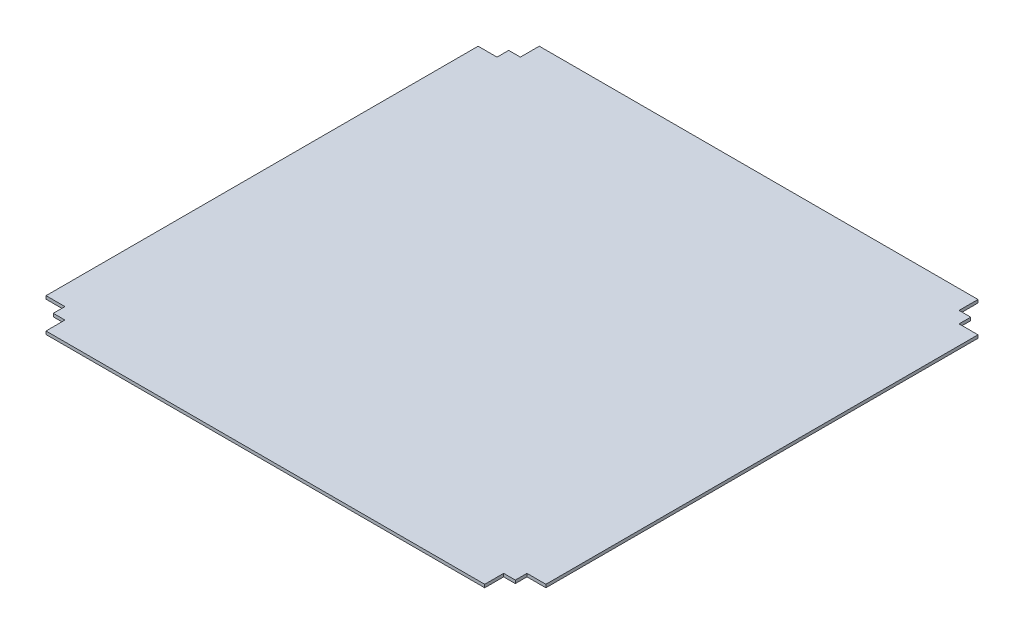
ISO-10303-21;
HEADER;
FILE_DESCRIPTION(('STEP AP214'),'2;1');
FILE_NAME('part.step','',(''),(''),'','','');
FILE_SCHEMA(('AUTOMOTIVE_DESIGN { 1 0 10303 214 1 1 1 1 }'));
ENDSEC;
DATA;
#1=APPLICATION_CONTEXT('core data for automotive mechanical design processes');
#2=APPLICATION_PROTOCOL_DEFINITION('international standard','automotive_design',2000,#1);
#3=PRODUCT_CONTEXT('',#1,'mechanical');
#4=PRODUCT('Part','Part','',(#3));
#5=PRODUCT_RELATED_PRODUCT_CATEGORY('part','',(#4));
#6=PRODUCT_DEFINITION_FORMATION('','',#4);
#7=PRODUCT_DEFINITION_CONTEXT('part definition',#1,'design');
#8=PRODUCT_DEFINITION('design','',#6,#7);
#9=PRODUCT_DEFINITION_SHAPE('','',#8);
#10=(LENGTH_UNIT() NAMED_UNIT(*) SI_UNIT(.MILLI.,.METRE.));
#11=(NAMED_UNIT(*) PLANE_ANGLE_UNIT() SI_UNIT($,.RADIAN.));
#12=(NAMED_UNIT(*) SI_UNIT($,.STERADIAN.) SOLID_ANGLE_UNIT());
#13=UNCERTAINTY_MEASURE_WITH_UNIT(LENGTH_MEASURE(1.E-05),#10,'distance_accuracy_value','');
#14=(GEOMETRIC_REPRESENTATION_CONTEXT(3) GLOBAL_UNCERTAINTY_ASSIGNED_CONTEXT((#13)) GLOBAL_UNIT_ASSIGNED_CONTEXT((#10,
#11,#12)) REPRESENTATION_CONTEXT('',''));
#15=CARTESIAN_POINT('',(0.,0.,0.));
#16=DIRECTION('',(0.,0.,1.));
#17=DIRECTION('',(1.,0.,0.));
#18=AXIS2_PLACEMENT_3D('',#15,#16,#17);
#19=CARTESIAN_POINT('',(257.25,3.175,-253.875));
#20=DIRECTION('',(-1.,0.,0.));
#21=DIRECTION('',(0.,0.,1.));
#22=AXIS2_PLACEMENT_3D('',#19,#20,#21);
#23=PLANE('',#22);
#24=DIRECTION('',(0.,0.,-1.));
#25=VECTOR('',#24,1.);
#26=CARTESIAN_POINT('',(257.25,0.,-253.875));
#27=LINE('',#26,#25);
#28=CARTESIAN_POINT('',(257.25,-6.07191814189223E-10,222.375000000014));
#29=VERTEX_POINT('',#28);
#30=CARTESIAN_POINT('',(257.25,-6.07191814189223E-10,-222.37500000019));
#31=VERTEX_POINT('',#30);
#32=EDGE_CURVE('E269',#29,#31,#27,.T.);
#33=ORIENTED_EDGE('',*,*,#32,.T.);
#34=DIRECTION('',(0.,1.,0.));
#35=VECTOR('',#34,1.);
#36=CARTESIAN_POINT('',(257.25,-6.07191814189223E-10,-222.37500000019));
#37=LINE('',#36,#35);
#38=CARTESIAN_POINT('',(257.25,3.175,-222.37500000019));
#39=VERTEX_POINT('',#38);
#40=EDGE_CURVE('E294',#31,#39,#37,.T.);
#41=ORIENTED_EDGE('',*,*,#40,.T.);
#42=DIRECTION('',(0.,0.,-1.));
#43=VECTOR('',#42,1.);
#44=CARTESIAN_POINT('',(257.25,3.175,-253.875));
#45=LINE('',#44,#43);
#46=CARTESIAN_POINT('',(257.25,3.175,222.375000000014));
#47=VERTEX_POINT('',#46);
#48=EDGE_CURVE('E257',#47,#39,#45,.T.);
#49=ORIENTED_EDGE('',*,*,#48,.F.);
#50=DIRECTION('',(0.,1.,0.));
#51=VECTOR('',#50,1.);
#52=CARTESIAN_POINT('',(257.25,-6.07191814189223E-10,222.375000000014));
#53=LINE('',#52,#51);
#54=EDGE_CURVE('E249',#29,#47,#53,.T.);
#55=ORIENTED_EDGE('',*,*,#54,.F.);
#56=EDGE_LOOP('',(#33,#41,#49,#55));
#57=FACE_BOUND('',#56,.T.);
#58=ADVANCED_FACE('F91',(#57),#23,.F.);
#59=CARTESIAN_POINT('',(-257.25,3.175,-253.875));
#60=DIRECTION('',(1.,0.,0.));
#61=DIRECTION('',(0.,0.,-1.));
#62=AXIS2_PLACEMENT_3D('',#59,#60,#61);
#63=PLANE('',#62);
#64=DIRECTION('',(0.,0.,1.));
#65=VECTOR('',#64,1.);
#66=CARTESIAN_POINT('',(-257.25,0.,-253.875));
#67=LINE('',#66,#65);
#68=CARTESIAN_POINT('',(-257.25,-6.07191814189223E-10,-222.374999999792));
#69=VERTEX_POINT('',#68);
#70=CARTESIAN_POINT('',(-257.25,-6.07191814189223E-10,222.375000000257));
#71=VERTEX_POINT('',#70);
#72=EDGE_CURVE('E273',#69,#71,#67,.T.);
#73=ORIENTED_EDGE('',*,*,#72,.T.);
#74=DIRECTION('',(0.,1.,0.));
#75=VECTOR('',#74,1.);
#76=CARTESIAN_POINT('',(-257.25,-6.07191814189223E-10,222.375000000257));
#77=LINE('',#76,#75);
#78=CARTESIAN_POINT('',(-257.25,3.175,222.375000000257));
#79=VERTEX_POINT('',#78);
#80=EDGE_CURVE('E390',#71,#79,#77,.T.);
#81=ORIENTED_EDGE('',*,*,#80,.T.);
#82=DIRECTION('',(0.,0.,1.));
#83=VECTOR('',#82,1.);
#84=CARTESIAN_POINT('',(-257.25,3.175,-253.875));
#85=LINE('',#84,#83);
#86=CARTESIAN_POINT('',(-257.25,3.175,-222.374999999792));
#87=VERTEX_POINT('',#86);
#88=EDGE_CURVE('E256',#87,#79,#85,.T.);
#89=ORIENTED_EDGE('',*,*,#88,.F.);
#90=DIRECTION('',(0.,1.,0.));
#91=VECTOR('',#90,1.);
#92=CARTESIAN_POINT('',(-257.25,-6.07191814189223E-10,-222.374999999792));
#93=LINE('',#92,#91);
#94=EDGE_CURVE('E250',#69,#87,#93,.T.);
#95=ORIENTED_EDGE('',*,*,#94,.F.);
#96=EDGE_LOOP('',(#73,#81,#89,#95));
#97=FACE_BOUND('',#96,.T.);
#98=ADVANCED_FACE('F416',(#97),#63,.F.);
#99=CARTESIAN_POINT('',(0.,0.,0.));
#100=DIRECTION('',(0.,1.,0.));
#101=DIRECTION('',(0.,0.,1.));
#102=AXIS2_PLACEMENT_3D('',#99,#100,#101);
#103=PLANE('',#102);
#104=DIRECTION('',(1.,0.,0.));
#105=VECTOR('',#104,1.);
#106=CARTESIAN_POINT('',(0.,0.,222.375000000257));
#107=LINE('',#106,#105);
#108=CARTESIAN_POINT('',(-237.787500000013,-2.44856218634126E-12,222.375000000257));
#109=VERTEX_POINT('',#108);
#110=EDGE_CURVE('E281',#71,#109,#107,.T.);
#111=ORIENTED_EDGE('',*,*,#110,.F.);
#112=ORIENTED_EDGE('',*,*,#72,.F.);
#113=DIRECTION('',(-1.,0.,0.));
#114=VECTOR('',#113,1.);
#115=CARTESIAN_POINT('',(-2.35356624052224E-12,0.,-222.374999999794));
#116=LINE('',#115,#114);
#117=CARTESIAN_POINT('',(-237.787500000388,1.99272889855884E-10,-222.374999999792));
#118=VERTEX_POINT('',#117);
#119=EDGE_CURVE('E268',#118,#69,#116,.T.);
#120=ORIENTED_EDGE('',*,*,#119,.F.);
#121=DIRECTION('',(0.,0.,1.));
#122=VECTOR('',#121,1.);
#123=CARTESIAN_POINT('',(-237.787500000388,1.99186587362954E-10,-234.374999999792));
#124=LINE('',#123,#122);
#125=CARTESIAN_POINT('',(-237.787500000388,1.99186587362954E-10,-234.374999999792));
#126=VERTEX_POINT('',#125);
#127=EDGE_CURVE('E346',#126,#118,#124,.T.);
#128=ORIENTED_EDGE('',*,*,#127,.F.);
#129=DIRECTION('',(1.,0.,0.));
#130=VECTOR('',#129,1.);
#131=CARTESIAN_POINT('',(-253.253077604334,1.99130642530854E-10,-234.374999999792));
#132=LINE('',#131,#130);
#133=CARTESIAN_POINT('',(-225.787500000388,1.99229738609419E-10,-234.374999999792));
#134=VERTEX_POINT('',#133);
#135=EDGE_CURVE('E343',#126,#134,#132,.T.);
#136=ORIENTED_EDGE('',*,*,#135,.T.);
#137=DIRECTION('',(0.,0.,1.));
#138=VECTOR('',#137,1.);
#139=CARTESIAN_POINT('',(-225.787500000386,0.,2.38968336158883E-12));
#140=LINE('',#139,#138);
#141=CARTESIAN_POINT('',(-225.787500000388,-6.07191814189223E-10,-253.875));
#142=VERTEX_POINT('',#141);
#143=EDGE_CURVE('E279',#142,#134,#140,.T.);
#144=ORIENTED_EDGE('',*,*,#143,.F.);
#145=DIRECTION('',(-1.,0.,0.));
#146=VECTOR('',#145,1.);
#147=CARTESIAN_POINT('',(-257.25,0.,-253.875));
#148=LINE('',#147,#146);
#149=CARTESIAN_POINT('',(225.787499999742,-6.07191814189223E-10,-253.875));
#150=VERTEX_POINT('',#149);
#151=EDGE_CURVE('E248',#150,#142,#148,.T.);
#152=ORIENTED_EDGE('',*,*,#151,.F.);
#153=DIRECTION('',(0.,0.,-1.));
#154=VECTOR('',#153,1.);
#155=CARTESIAN_POINT('',(225.787499999743,0.,-1.60135051878888E-12));
#156=LINE('',#155,#154);
#157=CARTESIAN_POINT('',(225.787499999742,-6.07191814189223E-10,-234.37500000019));
#158=VERTEX_POINT('',#157);
#159=EDGE_CURVE('E12',#158,#150,#156,.T.);
#160=ORIENTED_EDGE('',*,*,#159,.F.);
#161=DIRECTION('',(-1.,0.,0.));
#162=VECTOR('',#161,1.);
#163=CARTESIAN_POINT('',(237.787499999742,-6.07148446102324E-10,-234.37500000019));
#164=LINE('',#163,#162);
#165=CARTESIAN_POINT('',(237.787499999742,-6.07148446102324E-10,-234.37500000019));
#166=VERTEX_POINT('',#165);
#167=EDGE_CURVE('E306',#166,#158,#164,.T.);
#168=ORIENTED_EDGE('',*,*,#167,.F.);
#169=DIRECTION('',(0.,0.,1.));
#170=VECTOR('',#169,1.);
#171=CARTESIAN_POINT('',(237.787499999742,-6.07259902085655E-10,-249.840577604136));
#172=LINE('',#171,#170);
#173=CARTESIAN_POINT('',(237.787499999742,-6.07062143609394E-10,-222.37500000019));
#174=VERTEX_POINT('',#173);
#175=EDGE_CURVE('E300',#166,#174,#172,.T.);
#176=ORIENTED_EDGE('',*,*,#175,.T.);
#177=DIRECTION('',(-1.,0.,0.));
#178=VECTOR('',#177,1.);
#179=CARTESIAN_POINT('',(-1.57714807780051E-12,0.,-222.375000000188));
#180=LINE('',#179,#178);
#181=EDGE_CURVE('E98',#31,#174,#180,.T.);
#182=ORIENTED_EDGE('',*,*,#181,.F.);
#183=ORIENTED_EDGE('',*,*,#32,.F.);
#184=DIRECTION('',(1.,0.,0.));
#185=VECTOR('',#184,1.);
#186=CARTESIAN_POINT('',(8.00729915073988E-13,0.,222.375000000015));
#187=LINE('',#186,#185);
#188=CARTESIAN_POINT('',(237.787499999974,2.48412401759879E-12,222.375000000014));
#189=VERTEX_POINT('',#188);
#190=EDGE_CURVE('E285',#189,#29,#187,.T.);
#191=ORIENTED_EDGE('',*,*,#190,.F.);
#192=DIRECTION('',(0.,0.,-1.));
#193=VECTOR('',#192,1.);
#194=CARTESIAN_POINT('',(237.787499999974,2.57042651052863E-12,234.375000000014));
#195=LINE('',#194,#193);
#196=CARTESIAN_POINT('',(237.787499999974,2.57042651052863E-12,234.375000000014));
#197=VERTEX_POINT('',#196);
#198=EDGE_CURVE('E302',#197,#189,#195,.T.);
#199=ORIENTED_EDGE('',*,*,#198,.F.);
#200=DIRECTION('',(-1.,0.,0.));
#201=VECTOR('',#200,1.);
#202=CARTESIAN_POINT('',(253.25307760392,2.62637134262889E-12,234.375000000014));
#203=LINE('',#202,#201);
#204=CARTESIAN_POINT('',(225.787499999974,2.52727526406371E-12,234.375000000014));
#205=VERTEX_POINT('',#204);
#206=EDGE_CURVE('E317',#197,#205,#203,.T.);
#207=ORIENTED_EDGE('',*,*,#206,.T.);
#208=DIRECTION('',(0.,0.,-1.));
#209=VECTOR('',#208,1.);
#210=CARTESIAN_POINT('',(225.787499999974,0.,-8.13017675996566E-13));
#211=LINE('',#210,#209);
#212=CARTESIAN_POINT('',(225.787499999974,-6.07191814189223E-10,253.875));
#213=VERTEX_POINT('',#212);
#214=EDGE_CURVE('E287',#213,#205,#211,.T.);
#215=ORIENTED_EDGE('',*,*,#214,.F.);
#216=DIRECTION('',(1.,0.,0.));
#217=VECTOR('',#216,1.);
#218=CARTESIAN_POINT('',(-257.25,0.,253.875));
#219=LINE('',#218,#217);
#220=CARTESIAN_POINT('',(-225.787500000013,-6.07191814189223E-10,253.875));
#221=VERTEX_POINT('',#220);
#222=EDGE_CURVE('E262',#221,#213,#219,.T.);
#223=ORIENTED_EDGE('',*,*,#222,.F.);
#224=DIRECTION('',(0.,0.,1.));
#225=VECTOR('',#224,1.);
#226=CARTESIAN_POINT('',(-225.787500000013,0.,0.));
#227=LINE('',#226,#225);
#228=CARTESIAN_POINT('',(-225.787500000013,-2.318891606512E-12,234.375000000257));
#229=VERTEX_POINT('',#228);
#230=EDGE_CURVE('E283',#229,#221,#227,.T.);
#231=ORIENTED_EDGE('',*,*,#230,.F.);
#232=DIRECTION('',(1.,0.,0.));
#233=VECTOR('',#232,1.);
#234=CARTESIAN_POINT('',(-237.787500000013,-2.36225969341142E-12,234.375000000257));
#235=LINE('',#234,#233);
#236=CARTESIAN_POINT('',(-237.787500000013,-2.36225969341142E-12,234.375000000257));
#237=VERTEX_POINT('',#236);
#238=EDGE_CURVE('E323',#237,#229,#235,.T.);
#239=ORIENTED_EDGE('',*,*,#238,.F.);
#240=DIRECTION('',(0.,0.,-1.));
#241=VECTOR('',#240,1.);
#242=CARTESIAN_POINT('',(-237.787500000013,-2.25080371007991E-12,249.840577604203));
#243=LINE('',#242,#241);
#244=EDGE_CURVE('E330',#237,#109,#243,.T.);
#245=ORIENTED_EDGE('',*,*,#244,.T.);
#246=EDGE_LOOP('',(#111,#112,#120,#128,#136,#144,#152,#160,#168,#176,#182,#183,#191,#199,#207,
#215,#223,#231,#239,#245));
#247=FACE_BOUND('',#246,.T.);
#248=ADVANCED_FACE('F304',(#247),#103,.F.);
#249=CARTESIAN_POINT('',(-257.25,3.175,-253.875));
#250=DIRECTION('',(0.,0.,1.));
#251=DIRECTION('',(1.,0.,0.));
#252=AXIS2_PLACEMENT_3D('',#249,#250,#251);
#253=PLANE('',#252);
#254=DIRECTION('',(0.,1.,0.));
#255=VECTOR('',#254,1.);
#256=CARTESIAN_POINT('',(225.787499999742,-6.07191814189223E-10,-253.875));
#257=LINE('',#256,#255);
#258=CARTESIAN_POINT('',(225.787499999742,3.175,-253.875));
#259=VERTEX_POINT('',#258);
#260=EDGE_CURVE('E381',#150,#259,#257,.T.);
#261=ORIENTED_EDGE('',*,*,#260,.F.);
#262=ORIENTED_EDGE('',*,*,#151,.T.);
#263=DIRECTION('',(0.,1.,0.));
#264=VECTOR('',#263,1.);
#265=CARTESIAN_POINT('',(-225.787500000388,-6.07191814189223E-10,-253.875));
#266=LINE('',#265,#264);
#267=CARTESIAN_POINT('',(-225.787500000388,3.175,-253.875));
#268=VERTEX_POINT('',#267);
#269=EDGE_CURVE('E232',#142,#268,#266,.T.);
#270=ORIENTED_EDGE('',*,*,#269,.T.);
#271=DIRECTION('',(-1.,0.,0.));
#272=VECTOR('',#271,1.);
#273=CARTESIAN_POINT('',(-257.25,3.175,-253.875));
#274=LINE('',#273,#272);
#275=EDGE_CURVE('E246',#259,#268,#274,.T.);
#276=ORIENTED_EDGE('',*,*,#275,.F.);
#277=EDGE_LOOP('',(#261,#262,#270,#276));
#278=FACE_BOUND('',#277,.T.);
#279=ADVANCED_FACE('F245',(#278),#253,.F.);
#280=CARTESIAN_POINT('',(-257.25,3.175,253.875));
#281=DIRECTION('',(0.,0.,-1.));
#282=DIRECTION('',(-1.,0.,0.));
#283=AXIS2_PLACEMENT_3D('',#280,#281,#282);
#284=PLANE('',#283);
#285=DIRECTION('',(0.,1.,0.));
#286=VECTOR('',#285,1.);
#287=CARTESIAN_POINT('',(-225.787500000013,-6.07191814189223E-10,253.875));
#288=LINE('',#287,#286);
#289=CARTESIAN_POINT('',(-225.787500000013,3.175,253.875));
#290=VERTEX_POINT('',#289);
#291=EDGE_CURVE('E385',#221,#290,#288,.T.);
#292=ORIENTED_EDGE('',*,*,#291,.F.);
#293=ORIENTED_EDGE('',*,*,#222,.T.);
#294=DIRECTION('',(0.,1.,0.));
#295=VECTOR('',#294,1.);
#296=CARTESIAN_POINT('',(225.787499999974,-6.07191814189223E-10,253.875));
#297=LINE('',#296,#295);
#298=CARTESIAN_POINT('',(225.787499999974,3.175,253.875));
#299=VERTEX_POINT('',#298);
#300=EDGE_CURVE('E336',#213,#299,#297,.T.);
#301=ORIENTED_EDGE('',*,*,#300,.T.);
#302=DIRECTION('',(1.,0.,0.));
#303=VECTOR('',#302,1.);
#304=CARTESIAN_POINT('',(-257.25,3.175,253.875));
#305=LINE('',#304,#303);
#306=EDGE_CURVE('E259',#290,#299,#305,.T.);
#307=ORIENTED_EDGE('',*,*,#306,.F.);
#308=EDGE_LOOP('',(#292,#293,#301,#307));
#309=FACE_BOUND('',#308,.T.);
#310=ADVANCED_FACE('F437',(#309),#284,.F.);
#311=CARTESIAN_POINT('',(0.,3.175,0.));
#312=DIRECTION('',(0.,1.,0.));
#313=DIRECTION('',(0.,0.,1.));
#314=AXIS2_PLACEMENT_3D('',#311,#312,#313);
#315=PLANE('',#314);
#316=ORIENTED_EDGE('',*,*,#88,.T.);
#317=DIRECTION('',(1.,0.,0.));
#318=VECTOR('',#317,1.);
#319=CARTESIAN_POINT('',(0.,3.175,222.375000000257));
#320=LINE('',#319,#318);
#321=CARTESIAN_POINT('',(-237.787500000013,3.175,222.375000000257));
#322=VERTEX_POINT('',#321);
#323=EDGE_CURVE('E360',#79,#322,#320,.T.);
#324=ORIENTED_EDGE('',*,*,#323,.T.);
#325=DIRECTION('',(0.,0.,1.));
#326=VECTOR('',#325,1.);
#327=CARTESIAN_POINT('',(-237.787500000013,3.175,0.));
#328=LINE('',#327,#326);
#329=CARTESIAN_POINT('',(-237.787500000013,3.175,234.375000000257));
#330=VERTEX_POINT('',#329);
#331=EDGE_CURVE('E357',#322,#330,#328,.T.);
#332=ORIENTED_EDGE('',*,*,#331,.T.);
#333=DIRECTION('',(-1.,0.,0.));
#334=VECTOR('',#333,1.);
#335=CARTESIAN_POINT('',(0.,3.175,234.375000000257));
#336=LINE('',#335,#334);
#337=CARTESIAN_POINT('',(-225.787500000013,3.175,234.375000000257));
#338=VERTEX_POINT('',#337);
#339=EDGE_CURVE('E355',#338,#330,#336,.T.);
#340=ORIENTED_EDGE('',*,*,#339,.F.);
#341=DIRECTION('',(0.,0.,1.));
#342=VECTOR('',#341,1.);
#343=CARTESIAN_POINT('',(-225.787500000013,3.175,0.));
#344=LINE('',#343,#342);
#345=EDGE_CURVE('E363',#338,#290,#344,.T.);
#346=ORIENTED_EDGE('',*,*,#345,.T.);
#347=ORIENTED_EDGE('',*,*,#306,.T.);
#348=DIRECTION('',(0.,0.,-1.));
#349=VECTOR('',#348,1.);
#350=CARTESIAN_POINT('',(225.787499999974,3.175,-8.13017675996566E-13));
#351=LINE('',#350,#349);
#352=CARTESIAN_POINT('',(225.787499999974,3.175,234.375000000014));
#353=VERTEX_POINT('',#352);
#354=EDGE_CURVE('E370',#299,#353,#351,.T.);
#355=ORIENTED_EDGE('',*,*,#354,.T.);
#356=DIRECTION('',(1.,0.,0.));
#357=VECTOR('',#356,1.);
#358=CARTESIAN_POINT('',(8.43939623813222E-13,3.175,234.375000000015));
#359=LINE('',#358,#357);
#360=CARTESIAN_POINT('',(237.787499999974,3.175,234.375000000014));
#361=VERTEX_POINT('',#360);
#362=EDGE_CURVE('E367',#353,#361,#359,.T.);
#363=ORIENTED_EDGE('',*,*,#362,.T.);
#364=DIRECTION('',(0.,0.,1.));
#365=VECTOR('',#364,1.);
#366=CARTESIAN_POINT('',(237.787499999974,3.175,-8.56227384735801E-13));
#367=LINE('',#366,#365);
#368=CARTESIAN_POINT('',(237.787499999974,3.175,222.375000000014));
#369=VERTEX_POINT('',#368);
#370=EDGE_CURVE('E365',#369,#361,#367,.T.);
#371=ORIENTED_EDGE('',*,*,#370,.F.);
#372=DIRECTION('',(1.,0.,0.));
#373=VECTOR('',#372,1.);
#374=CARTESIAN_POINT('',(8.00729915073988E-13,3.175,222.375000000015));
#375=LINE('',#374,#373);
#376=EDGE_CURVE('E373',#369,#47,#375,.T.);
#377=ORIENTED_EDGE('',*,*,#376,.T.);
#378=ORIENTED_EDGE('',*,*,#48,.T.);
#379=DIRECTION('',(-1.,0.,0.));
#380=VECTOR('',#379,1.);
#381=CARTESIAN_POINT('',(-1.57714807780051E-12,3.175,-222.375000000188));
#382=LINE('',#381,#380);
#383=CARTESIAN_POINT('',(237.787499999742,3.175,-222.37500000019));
#384=VERTEX_POINT('',#383);
#385=EDGE_CURVE('E377',#39,#384,#382,.T.);
#386=ORIENTED_EDGE('',*,*,#385,.T.);
#387=DIRECTION('',(0.,0.,-1.));
#388=VECTOR('',#387,1.);
#389=CARTESIAN_POINT('',(237.787499999743,3.175,-1.68645800359424E-12));
#390=LINE('',#389,#388);
#391=CARTESIAN_POINT('',(237.787499999742,3.175,-234.37500000019));
#392=VERTEX_POINT('',#391);
#393=EDGE_CURVE('E105',#384,#392,#390,.T.);
#394=ORIENTED_EDGE('',*,*,#393,.T.);
#395=DIRECTION('',(1.,0.,0.));
#396=VECTOR('',#395,1.);
#397=CARTESIAN_POINT('',(-1.66225556260586E-12,3.175,-234.375000000188));
#398=LINE('',#397,#396);
#399=CARTESIAN_POINT('',(225.787499999742,3.175,-234.37500000019));
#400=VERTEX_POINT('',#399);
#401=EDGE_CURVE('E113',#400,#392,#398,.T.);
#402=ORIENTED_EDGE('',*,*,#401,.F.);
#403=DIRECTION('',(0.,0.,-1.));
#404=VECTOR('',#403,1.);
#405=CARTESIAN_POINT('',(225.787499999743,3.175,-1.60135051878888E-12));
#406=LINE('',#405,#404);
#407=EDGE_CURVE('E254',#400,#259,#406,.T.);
#408=ORIENTED_EDGE('',*,*,#407,.T.);
#409=ORIENTED_EDGE('',*,*,#275,.T.);
#410=DIRECTION('',(0.,0.,1.));
#411=VECTOR('',#410,1.);
#412=CARTESIAN_POINT('',(-225.787500000386,3.175,2.38968336158883E-12));
#413=LINE('',#412,#411);
#414=CARTESIAN_POINT('',(-225.787500000388,3.175,-234.374999999792));
#415=VERTEX_POINT('',#414);
#416=EDGE_CURVE('E229',#268,#415,#413,.T.);
#417=ORIENTED_EDGE('',*,*,#416,.T.);
#418=DIRECTION('',(-1.,0.,0.));
#419=VECTOR('',#418,1.);
#420=CARTESIAN_POINT('',(-2.48057150139371E-12,3.175,-234.374999999794));
#421=LINE('',#420,#419);
#422=CARTESIAN_POINT('',(-237.787500000388,3.175,-234.374999999792));
#423=VERTEX_POINT('',#422);
#424=EDGE_CURVE('E240',#415,#423,#421,.T.);
#425=ORIENTED_EDGE('',*,*,#424,.T.);
#426=DIRECTION('',(0.,0.,-1.));
#427=VECTOR('',#426,1.);
#428=CARTESIAN_POINT('',(-237.787500000386,3.175,2.5166886224603E-12));
#429=LINE('',#428,#427);
#430=CARTESIAN_POINT('',(-237.787500000388,3.175,-222.374999999792));
#431=VERTEX_POINT('',#430);
#432=EDGE_CURVE('E351',#431,#423,#429,.T.);
#433=ORIENTED_EDGE('',*,*,#432,.F.);
#434=DIRECTION('',(-1.,0.,0.));
#435=VECTOR('',#434,1.);
#436=CARTESIAN_POINT('',(-2.35356624052224E-12,3.175,-222.374999999794));
#437=LINE('',#436,#435);
#438=EDGE_CURVE('E239',#431,#87,#437,.T.);
#439=ORIENTED_EDGE('',*,*,#438,.T.);
#440=EDGE_LOOP('',(#316,#324,#332,#340,#346,#347,#355,#363,#371,#377,#378,#386,#394,#402,#408,
#409,#417,#425,#433,#439));
#441=FACE_BOUND('',#440,.T.);
#442=ADVANCED_FACE('F253',(#441),#315,.T.);
#443=CARTESIAN_POINT('',(-240.787500000388,6.68750000019926,-222.374999999792));
#444=DIRECTION('',(0.,0.,-1.));
#445=DIRECTION('',(0.,1.,0.));
#446=AXIS2_PLACEMENT_3D('',#443,#444,#445);
#447=PLANE('',#446);
#448=DIRECTION('',(0.,1.,0.));
#449=VECTOR('',#448,1.);
#450=CARTESIAN_POINT('',(-237.787500000388,3.37500000019927,-222.374999999792));
#451=LINE('',#450,#449);
#452=EDGE_CURVE('E342',#118,#431,#451,.T.);
#453=ORIENTED_EDGE('',*,*,#452,.F.);
#454=ORIENTED_EDGE('',*,*,#119,.T.);
#455=ORIENTED_EDGE('',*,*,#94,.T.);
#456=ORIENTED_EDGE('',*,*,#438,.F.);
#457=EDGE_LOOP('',(#453,#454,#455,#456));
#458=FACE_BOUND('',#457,.T.);
#459=ADVANCED_FACE('F411',(#458),#447,.T.);
#460=CARTESIAN_POINT('',(-225.787500000388,6.68750000019921,-237.374999999792));
#461=DIRECTION('',(-1.,0.,0.));
#462=DIRECTION('',(0.,-1.,0.));
#463=AXIS2_PLACEMENT_3D('',#460,#461,#462);
#464=PLANE('',#463);
#465=ORIENTED_EDGE('',*,*,#416,.F.);
#466=ORIENTED_EDGE('',*,*,#269,.F.);
#467=ORIENTED_EDGE('',*,*,#143,.T.);
#468=DIRECTION('',(0.,1.,0.));
#469=VECTOR('',#468,1.);
#470=CARTESIAN_POINT('',(-225.787500000388,3.37500000019923,-234.374999999792));
#471=LINE('',#470,#469);
#472=EDGE_CURVE('E235',#134,#415,#471,.T.);
#473=ORIENTED_EDGE('',*,*,#472,.T.);
#474=EDGE_LOOP('',(#465,#466,#467,#473));
#475=FACE_BOUND('',#474,.T.);
#476=ADVANCED_FACE('F231',(#475),#464,.T.);
#477=CARTESIAN_POINT('',(-253.253077604334,3.37500000019913,-234.374999999792));
#478=DIRECTION('',(0.,0.,-1.));
#479=DIRECTION('',(0.,1.,0.));
#480=AXIS2_PLACEMENT_3D('',#477,#478,#479);
#481=PLANE('',#480);
#482=ORIENTED_EDGE('',*,*,#472,.F.);
#483=ORIENTED_EDGE('',*,*,#135,.F.);
#484=DIRECTION('',(0.,-1.,0.));
#485=VECTOR('',#484,1.);
#486=CARTESIAN_POINT('',(-237.787500000388,3.37500000019919,-234.374999999792));
#487=LINE('',#486,#485);
#488=EDGE_CURVE('E340',#423,#126,#487,.T.);
#489=ORIENTED_EDGE('',*,*,#488,.F.);
#490=ORIENTED_EDGE('',*,*,#424,.F.);
#491=EDGE_LOOP('',(#482,#483,#489,#490));
#492=FACE_BOUND('',#491,.T.);
#493=ADVANCED_FACE('F403',(#492),#481,.T.);
#494=CARTESIAN_POINT('',(-237.787500000388,6.68750000019917,-237.374999999792));
#495=DIRECTION('',(1.,0.,0.));
#496=DIRECTION('',(0.,1.,0.));
#497=AXIS2_PLACEMENT_3D('',#494,#495,#496);
#498=PLANE('',#497);
#499=ORIENTED_EDGE('',*,*,#432,.T.);
#500=ORIENTED_EDGE('',*,*,#488,.T.);
#501=ORIENTED_EDGE('',*,*,#127,.T.);
#502=ORIENTED_EDGE('',*,*,#452,.T.);
#503=EDGE_LOOP('',(#499,#500,#501,#502));
#504=FACE_BOUND('',#503,.T.);
#505=ADVANCED_FACE('F407',(#504),#498,.F.);
#506=CARTESIAN_POINT('',(-225.787500000013,6.6874999999977,237.375000000257));
#507=DIRECTION('',(-1.,0.,0.));
#508=DIRECTION('',(0.,1.,0.));
#509=AXIS2_PLACEMENT_3D('',#506,#507,#508);
#510=PLANE('',#509);
#511=DIRECTION('',(0.,1.,0.));
#512=VECTOR('',#511,1.);
#513=CARTESIAN_POINT('',(-225.787500000013,3.37499999999768,234.375000000257));
#514=LINE('',#513,#512);
#515=EDGE_CURVE('E329',#229,#338,#514,.T.);
#516=ORIENTED_EDGE('',*,*,#515,.F.);
#517=ORIENTED_EDGE('',*,*,#230,.T.);
#518=ORIENTED_EDGE('',*,*,#291,.T.);
#519=ORIENTED_EDGE('',*,*,#345,.F.);
#520=EDGE_LOOP('',(#516,#517,#518,#519));
#521=FACE_BOUND('',#520,.T.);
#522=ADVANCED_FACE('F433',(#521),#510,.T.);
#523=CARTESIAN_POINT('',(-240.787500000013,6.68749999999754,222.375000000257));
#524=DIRECTION('',(0.,0.,1.));
#525=DIRECTION('',(0.,-1.,0.));
#526=AXIS2_PLACEMENT_3D('',#523,#524,#525);
#527=PLANE('',#526);
#528=ORIENTED_EDGE('',*,*,#323,.F.);
#529=ORIENTED_EDGE('',*,*,#80,.F.);
#530=ORIENTED_EDGE('',*,*,#110,.T.);
#531=DIRECTION('',(0.,1.,0.));
#532=VECTOR('',#531,1.);
#533=CARTESIAN_POINT('',(-237.787500000013,3.37499999999755,222.375000000257));
#534=LINE('',#533,#532);
#535=EDGE_CURVE('E333',#109,#322,#534,.T.);
#536=ORIENTED_EDGE('',*,*,#535,.T.);
#537=EDGE_LOOP('',(#528,#529,#530,#536));
#538=FACE_BOUND('',#537,.T.);
#539=ADVANCED_FACE('F420',(#538),#527,.T.);
#540=CARTESIAN_POINT('',(-237.787500000013,3.37499999999775,249.840577604203));
#541=DIRECTION('',(-1.,0.,0.));
#542=DIRECTION('',(0.,1.,0.));
#543=AXIS2_PLACEMENT_3D('',#540,#541,#542);
#544=PLANE('',#543);
#545=ORIENTED_EDGE('',*,*,#535,.F.);
#546=ORIENTED_EDGE('',*,*,#244,.F.);
#547=DIRECTION('',(0.,-1.,0.));
#548=VECTOR('',#547,1.);
#549=CARTESIAN_POINT('',(-237.787500000013,3.37499999999764,234.375000000257));
#550=LINE('',#549,#548);
#551=EDGE_CURVE('E327',#330,#237,#550,.T.);
#552=ORIENTED_EDGE('',*,*,#551,.F.);
#553=ORIENTED_EDGE('',*,*,#331,.F.);
#554=EDGE_LOOP('',(#545,#546,#552,#553));
#555=FACE_BOUND('',#554,.T.);
#556=ADVANCED_FACE('F424',(#555),#544,.T.);
#557=CARTESIAN_POINT('',(-240.787500000013,6.68749999999763,234.375000000257));
#558=DIRECTION('',(0.,0.,-1.));
#559=DIRECTION('',(0.,1.,0.));
#560=AXIS2_PLACEMENT_3D('',#557,#558,#559);
#561=PLANE('',#560);
#562=ORIENTED_EDGE('',*,*,#339,.T.);
#563=ORIENTED_EDGE('',*,*,#551,.T.);
#564=ORIENTED_EDGE('',*,*,#238,.T.);
#565=ORIENTED_EDGE('',*,*,#515,.T.);
#566=EDGE_LOOP('',(#562,#563,#564,#565));
#567=FACE_BOUND('',#566,.T.);
#568=ADVANCED_FACE('F431',(#567),#561,.F.);
#569=CARTESIAN_POINT('',(240.787499999974,6.6875000000025,222.375000000014));
#570=DIRECTION('',(0.,0.,1.));
#571=DIRECTION('',(0.,1.,0.));
#572=AXIS2_PLACEMENT_3D('',#569,#570,#571);
#573=PLANE('',#572);
#574=DIRECTION('',(0.,1.,0.));
#575=VECTOR('',#574,1.);
#576=CARTESIAN_POINT('',(237.787499999974,3.37500000000249,222.375000000014));
#577=LINE('',#576,#575);
#578=EDGE_CURVE('E316',#189,#369,#577,.T.);
#579=ORIENTED_EDGE('',*,*,#578,.F.);
#580=ORIENTED_EDGE('',*,*,#190,.T.);
#581=ORIENTED_EDGE('',*,*,#54,.T.);
#582=ORIENTED_EDGE('',*,*,#376,.F.);
#583=EDGE_LOOP('',(#579,#580,#581,#582));
#584=FACE_BOUND('',#583,.T.);
#585=ADVANCED_FACE('F453',(#584),#573,.T.);
#586=CARTESIAN_POINT('',(225.787499999974,6.68750000000255,237.375000000014));
#587=DIRECTION('',(1.,0.,0.));
#588=DIRECTION('',(0.,-1.,0.));
#589=AXIS2_PLACEMENT_3D('',#586,#587,#588);
#590=PLANE('',#589);
#591=ORIENTED_EDGE('',*,*,#354,.F.);
#592=ORIENTED_EDGE('',*,*,#300,.F.);
#593=ORIENTED_EDGE('',*,*,#214,.T.);
#594=DIRECTION('',(0.,1.,0.));
#595=VECTOR('',#594,1.);
#596=CARTESIAN_POINT('',(225.787499999974,3.37500000000253,234.375000000014));
#597=LINE('',#596,#595);
#598=EDGE_CURVE('E320',#205,#353,#597,.T.);
#599=ORIENTED_EDGE('',*,*,#598,.T.);
#600=EDGE_LOOP('',(#591,#592,#593,#599));
#601=FACE_BOUND('',#600,.T.);
#602=ADVANCED_FACE('F440',(#601),#590,.T.);
#603=CARTESIAN_POINT('',(253.25307760392,3.37500000000263,234.375000000014));
#604=DIRECTION('',(0.,0.,1.));
#605=DIRECTION('',(0.,1.,0.));
#606=AXIS2_PLACEMENT_3D('',#603,#604,#605);
#607=PLANE('',#606);
#608=ORIENTED_EDGE('',*,*,#598,.F.);
#609=ORIENTED_EDGE('',*,*,#206,.F.);
#610=DIRECTION('',(0.,-1.,0.));
#611=VECTOR('',#610,1.);
#612=CARTESIAN_POINT('',(237.787499999974,3.37500000000257,234.375000000014));
#613=LINE('',#612,#611);
#614=EDGE_CURVE('E314',#361,#197,#613,.T.);
#615=ORIENTED_EDGE('',*,*,#614,.F.);
#616=ORIENTED_EDGE('',*,*,#362,.F.);
#617=EDGE_LOOP('',(#608,#609,#615,#616));
#618=FACE_BOUND('',#617,.T.);
#619=ADVANCED_FACE('F444',(#618),#607,.T.);
#620=CARTESIAN_POINT('',(237.787499999974,6.68750000000259,237.375000000014));
#621=DIRECTION('',(-1.,0.,0.));
#622=DIRECTION('',(0.,1.,0.));
#623=AXIS2_PLACEMENT_3D('',#620,#621,#622);
#624=PLANE('',#623);
#625=ORIENTED_EDGE('',*,*,#370,.T.);
#626=ORIENTED_EDGE('',*,*,#614,.T.);
#627=ORIENTED_EDGE('',*,*,#198,.T.);
#628=ORIENTED_EDGE('',*,*,#578,.T.);
#629=EDGE_LOOP('',(#625,#626,#627,#628));
#630=FACE_BOUND('',#629,.T.);
#631=ADVANCED_FACE('F450',(#630),#624,.F.);
#632=CARTESIAN_POINT('',(225.787499999742,6.68749999939279,-237.37500000019));
#633=DIRECTION('',(1.,0.,0.));
#634=DIRECTION('',(0.,1.,0.));
#635=AXIS2_PLACEMENT_3D('',#632,#633,#634);
#636=PLANE('',#635);
#637=DIRECTION('',(0.,1.,0.));
#638=VECTOR('',#637,1.);
#639=CARTESIAN_POINT('',(225.787499999742,3.37499999939281,-234.37500000019));
#640=LINE('',#639,#638);
#641=EDGE_CURVE('E309',#158,#400,#640,.T.);
#642=ORIENTED_EDGE('',*,*,#641,.F.);
#643=ORIENTED_EDGE('',*,*,#159,.T.);
#644=ORIENTED_EDGE('',*,*,#260,.T.);
#645=ORIENTED_EDGE('',*,*,#407,.F.);
#646=EDGE_LOOP('',(#642,#643,#644,#645));
#647=FACE_BOUND('',#646,.T.);
#648=ADVANCED_FACE('F399',(#647),#636,.T.);
#649=CARTESIAN_POINT('',(240.787499999742,6.68749999939295,-222.37500000019));
#650=DIRECTION('',(0.,0.,-1.));
#651=DIRECTION('',(0.,-1.,0.));
#652=AXIS2_PLACEMENT_3D('',#649,#650,#651);
#653=PLANE('',#652);
#654=ORIENTED_EDGE('',*,*,#385,.F.);
#655=ORIENTED_EDGE('',*,*,#40,.F.);
#656=ORIENTED_EDGE('',*,*,#181,.T.);
#657=DIRECTION('',(0.,1.,0.));
#658=VECTOR('',#657,1.);
#659=CARTESIAN_POINT('',(237.787499999742,3.37499999939294,-222.37500000019));
#660=LINE('',#659,#658);
#661=EDGE_CURVE('E291',#174,#384,#660,.T.);
#662=ORIENTED_EDGE('',*,*,#661,.T.);
#663=EDGE_LOOP('',(#654,#655,#656,#662));
#664=FACE_BOUND('',#663,.T.);
#665=ADVANCED_FACE('F290',(#664),#653,.T.);
#666=CARTESIAN_POINT('',(237.787499999742,3.37499999939274,-249.840577604136));
#667=DIRECTION('',(1.,0.,0.));
#668=DIRECTION('',(0.,1.,0.));
#669=AXIS2_PLACEMENT_3D('',#666,#667,#668);
#670=PLANE('',#669);
#671=ORIENTED_EDGE('',*,*,#661,.F.);
#672=ORIENTED_EDGE('',*,*,#175,.F.);
#673=DIRECTION('',(0.,-1.,0.));
#674=VECTOR('',#673,1.);
#675=CARTESIAN_POINT('',(237.787499999742,3.37499999939285,-234.37500000019));
#676=LINE('',#675,#674);
#677=EDGE_CURVE('E307',#392,#166,#676,.T.);
#678=ORIENTED_EDGE('',*,*,#677,.F.);
#679=ORIENTED_EDGE('',*,*,#393,.F.);
#680=EDGE_LOOP('',(#671,#672,#678,#679));
#681=FACE_BOUND('',#680,.T.);
#682=ADVANCED_FACE('F299',(#681),#670,.T.);
#683=CARTESIAN_POINT('',(240.787499999742,6.68749999939286,-234.37500000019));
#684=DIRECTION('',(0.,0.,1.));
#685=DIRECTION('',(0.,1.,0.));
#686=AXIS2_PLACEMENT_3D('',#683,#684,#685);
#687=PLANE('',#686);
#688=ORIENTED_EDGE('',*,*,#401,.T.);
#689=ORIENTED_EDGE('',*,*,#677,.T.);
#690=ORIENTED_EDGE('',*,*,#167,.T.);
#691=ORIENTED_EDGE('',*,*,#641,.T.);
#692=EDGE_LOOP('',(#688,#689,#690,#691));
#693=FACE_BOUND('',#692,.T.);
#694=ADVANCED_FACE('F397',(#693),#687,.F.);
#695=CLOSED_SHELL('',(#58,#98,#248,#279,#310,#442,#459,#476,#493,#505,#522,#539,#556,#568,#585,
#602,#619,#631,#648,#665,#682,#694));
#696=MANIFOLD_SOLID_BREP('B2',#695);
#697=ADVANCED_BREP_SHAPE_REPRESENTATION('',(#18,#696),#14);
#698=SHAPE_DEFINITION_REPRESENTATION(#9,#697);
ENDSEC;
END-ISO-10303-21;
